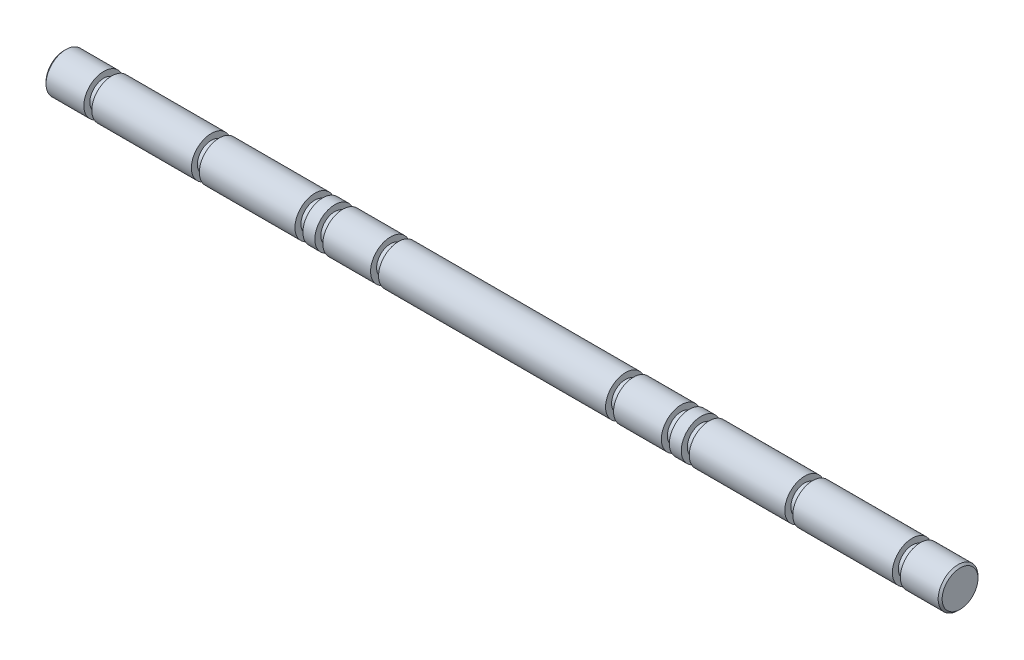
ISO-10303-21;
HEADER;
FILE_DESCRIPTION(('STEP AP214'),'2;1');
FILE_NAME('part.step','',(''),(''),'','','');
FILE_SCHEMA(('AUTOMOTIVE_DESIGN { 1 0 10303 214 1 1 1 1 }'));
ENDSEC;
DATA;
#1=APPLICATION_CONTEXT('core data for automotive mechanical design processes');
#2=APPLICATION_PROTOCOL_DEFINITION('international standard','automotive_design',2000,#1);
#3=PRODUCT_CONTEXT('',#1,'mechanical');
#4=PRODUCT('Part','Part','',(#3));
#5=PRODUCT_RELATED_PRODUCT_CATEGORY('part','',(#4));
#6=PRODUCT_DEFINITION_FORMATION('','',#4);
#7=PRODUCT_DEFINITION_CONTEXT('part definition',#1,'design');
#8=PRODUCT_DEFINITION('design','',#6,#7);
#9=PRODUCT_DEFINITION_SHAPE('','',#8);
#10=(LENGTH_UNIT() NAMED_UNIT(*) SI_UNIT(.MILLI.,.METRE.));
#11=(NAMED_UNIT(*) PLANE_ANGLE_UNIT() SI_UNIT($,.RADIAN.));
#12=(NAMED_UNIT(*) SI_UNIT($,.STERADIAN.) SOLID_ANGLE_UNIT());
#13=UNCERTAINTY_MEASURE_WITH_UNIT(LENGTH_MEASURE(1.E-05),#10,'distance_accuracy_value','');
#14=(GEOMETRIC_REPRESENTATION_CONTEXT(3) GLOBAL_UNCERTAINTY_ASSIGNED_CONTEXT((#13)) GLOBAL_UNIT_ASSIGNED_CONTEXT((#10,
#11,#12)) REPRESENTATION_CONTEXT('',''));
#15=CARTESIAN_POINT('',(0.,0.,0.));
#16=DIRECTION('',(0.,0.,1.));
#17=DIRECTION('',(1.,0.,0.));
#18=AXIS2_PLACEMENT_3D('',#15,#16,#17);
#19=CARTESIAN_POINT('',(57.,0.,0.));
#20=DIRECTION('',(-1.,0.,0.));
#21=DIRECTION('',(0.,0.,1.));
#22=AXIS2_PLACEMENT_3D('',#19,#20,#21);
#23=CYLINDRICAL_SURFACE('',#22,5.);
#24=CARTESIAN_POINT('',(57.,0.,0.));
#25=DIRECTION('',(1.,0.,0.));
#26=DIRECTION('',(0.,0.,-1.));
#27=AXIS2_PLACEMENT_3D('',#24,#25,#26);
#28=CIRCLE('',#27,5.);
#29=CARTESIAN_POINT('',(57.,0.,5.));
#30=VERTEX_POINT('',#29);
#31=EDGE_CURVE('E69',#30,#30,#28,.T.);
#32=CARTESIAN_POINT('',(0.,0.,0.));
#33=DIRECTION('',(1.,0.,0.));
#34=DIRECTION('',(0.,0.,-1.));
#35=AXIS2_PLACEMENT_3D('',#32,#33,#34);
#36=CIRCLE('',#35,5.);
#37=CARTESIAN_POINT('',(0.,0.,5.));
#38=VERTEX_POINT('',#37);
#39=EDGE_CURVE('E65',#38,#38,#36,.T.);
#40=CARTESIAN_POINT('',(57.,0.,5.));
#41=CARTESIAN_POINT('',(56.40625,0.,5.));
#42=CARTESIAN_POINT('',(55.8125,0.,5.));
#43=CARTESIAN_POINT('',(54.625,0.,5.));
#44=CARTESIAN_POINT('',(54.03125,0.,5.));
#45=CARTESIAN_POINT('',(52.84375,0.,5.));
#46=CARTESIAN_POINT('',(52.25,0.,5.));
#47=CARTESIAN_POINT('',(51.0625,0.,5.));
#48=CARTESIAN_POINT('',(50.46875,0.,5.));
#49=CARTESIAN_POINT('',(49.28125,0.,5.));
#50=CARTESIAN_POINT('',(48.6875,0.,5.));
#51=CARTESIAN_POINT('',(47.5,0.,5.));
#52=CARTESIAN_POINT('',(46.90625,0.,5.));
#53=CARTESIAN_POINT('',(45.71875,0.,5.));
#54=CARTESIAN_POINT('',(45.125,0.,5.));
#55=CARTESIAN_POINT('',(43.9375,0.,5.));
#56=CARTESIAN_POINT('',(43.34375,0.,5.));
#57=CARTESIAN_POINT('',(42.15625,0.,5.));
#58=CARTESIAN_POINT('',(41.5625,0.,5.));
#59=CARTESIAN_POINT('',(40.375,0.,5.));
#60=CARTESIAN_POINT('',(39.78125,0.,5.));
#61=CARTESIAN_POINT('',(38.59375,0.,5.));
#62=CARTESIAN_POINT('',(38.,0.,5.));
#63=CARTESIAN_POINT('',(36.8125,0.,5.));
#64=CARTESIAN_POINT('',(36.21875,0.,5.));
#65=CARTESIAN_POINT('',(35.03125,0.,5.));
#66=CARTESIAN_POINT('',(34.4375,0.,5.));
#67=CARTESIAN_POINT('',(33.25,0.,5.));
#68=CARTESIAN_POINT('',(32.65625,0.,5.));
#69=CARTESIAN_POINT('',(31.46875,0.,5.));
#70=CARTESIAN_POINT('',(30.875,0.,5.));
#71=CARTESIAN_POINT('',(29.6875,0.,5.));
#72=CARTESIAN_POINT('',(29.09375,0.,5.));
#73=CARTESIAN_POINT('',(27.90625,0.,5.));
#74=CARTESIAN_POINT('',(27.3125,0.,5.));
#75=CARTESIAN_POINT('',(26.125,0.,5.));
#76=CARTESIAN_POINT('',(25.53125,0.,5.));
#77=CARTESIAN_POINT('',(24.34375,0.,5.));
#78=CARTESIAN_POINT('',(23.75,0.,5.));
#79=CARTESIAN_POINT('',(22.5625,0.,5.));
#80=CARTESIAN_POINT('',(21.96875,0.,5.));
#81=CARTESIAN_POINT('',(20.78125,0.,5.));
#82=CARTESIAN_POINT('',(20.1875,0.,5.));
#83=CARTESIAN_POINT('',(19.,0.,5.));
#84=CARTESIAN_POINT('',(18.40625,0.,5.));
#85=CARTESIAN_POINT('',(17.21875,0.,5.));
#86=CARTESIAN_POINT('',(16.625,0.,5.));
#87=CARTESIAN_POINT('',(15.4375,0.,5.));
#88=CARTESIAN_POINT('',(14.84375,0.,5.));
#89=CARTESIAN_POINT('',(13.65625,0.,5.));
#90=CARTESIAN_POINT('',(13.0625,0.,5.));
#91=CARTESIAN_POINT('',(11.875,0.,5.));
#92=CARTESIAN_POINT('',(11.28125,0.,5.));
#93=CARTESIAN_POINT('',(10.09375,0.,5.));
#94=CARTESIAN_POINT('',(9.5,0.,5.));
#95=CARTESIAN_POINT('',(8.3125,0.,5.));
#96=CARTESIAN_POINT('',(7.71875,0.,5.));
#97=CARTESIAN_POINT('',(6.53125,0.,5.));
#98=CARTESIAN_POINT('',(5.9375,0.,5.));
#99=CARTESIAN_POINT('',(4.75,0.,5.));
#100=CARTESIAN_POINT('',(4.15625,0.,5.));
#101=CARTESIAN_POINT('',(2.96875,0.,5.));
#102=CARTESIAN_POINT('',(2.375,0.,5.));
#103=CARTESIAN_POINT('',(1.1875,0.,5.));
#104=CARTESIAN_POINT('',(0.593749999999999,0.,5.));
#105=CARTESIAN_POINT('',(0.,0.,5.));
#106=B_SPLINE_CURVE_WITH_KNOTS('',3,(#40,#41,#42,#43,#44,#45,#46,#47,#48,#49,#50,#51,#52,#53,
#54,#55,#56,#57,#58,#59,#60,#61,#62,#63,#64,#65,#66,#67,#68,#69,#70,#71,#72,#73,#74,#75,#76,#77,
#78,#79,#80,#81,#82,#83,#84,#85,#86,#87,#88,#89,#90,#91,#92,#93,#94,#95,#96,#97,#98,#99,#100,
#101,#102,#103,#104,#105),.UNSPECIFIED.,.F.,.F.,(4,2,2,2,2,2,2,2,2,2,2,2,2,2,2,2,2,2,2,2,2,2,2,
2,2,2,2,2,2,2,2,2,4),(0.,1.78125,3.5625,5.34374999999999,7.12499999999999,8.90625,10.6875,
12.46875,14.25,16.03125,17.8125,19.59375,21.375,23.15625,24.9375,26.71875,28.5,30.28125,32.0625,
33.84375,35.625,37.40625,39.1875,40.96875,42.75,44.53125,46.3125,48.09375,49.875,51.65625,
53.4375,55.21875,57.),.UNSPECIFIED.);
#107=EDGE_CURVE('BSEAM39',#30,#38,#106,.T.);
#108=ORIENTED_EDGE('',*,*,#31,.F.);
#109=ORIENTED_EDGE('',*,*,#39,.T.);
#110=ORIENTED_EDGE('',*,*,#107,.T.);
#111=ORIENTED_EDGE('',*,*,#107,.F.);
#112=EDGE_LOOP('',(#108,#110,#109,#111));
#113=FACE_BOUND('',#112,.T.);
#114=ADVANCED_FACE('F39',(#113),#23,.T.);
#115=CARTESIAN_POINT('',(57.,0.,0.));
#116=DIRECTION('',(1.,0.,0.));
#117=DIRECTION('',(0.,0.,-1.));
#118=AXIS2_PLACEMENT_3D('',#115,#116,#117);
#119=PLANE('',#118);
#120=CARTESIAN_POINT('',(57.,0.,0.));
#121=DIRECTION('',(1.,0.,0.));
#122=DIRECTION('',(0.,0.,-1.));
#123=AXIS2_PLACEMENT_3D('',#120,#121,#122);
#124=CIRCLE('',#123,3.5);
#125=CARTESIAN_POINT('',(57.,0.,-3.5));
#126=VERTEX_POINT('',#125);
#127=EDGE_CURVE('E78',#126,#126,#124,.T.);
#128=ORIENTED_EDGE('',*,*,#127,.F.);
#129=EDGE_LOOP('',(#128));
#130=FACE_BOUND('',#129,.T.);
#131=ORIENTED_EDGE('',*,*,#31,.T.);
#132=EDGE_LOOP('',(#131));
#133=FACE_BOUND('',#132,.T.);
#134=ADVANCED_FACE('F241',(#130,#133),#119,.T.);
#135=CARTESIAN_POINT('',(0.,0.,0.));
#136=DIRECTION('',(1.,0.,0.));
#137=DIRECTION('',(0.,0.,-1.));
#138=AXIS2_PLACEMENT_3D('',#135,#136,#137);
#139=PLANE('',#138);
#140=CARTESIAN_POINT('',(0.,0.,0.));
#141=DIRECTION('',(-1.,0.,0.));
#142=DIRECTION('',(0.,0.,1.));
#143=AXIS2_PLACEMENT_3D('',#140,#141,#142);
#144=CIRCLE('',#143,3.5);
#145=CARTESIAN_POINT('',(0.,0.,3.5));
#146=VERTEX_POINT('',#145);
#147=EDGE_CURVE('E74',#146,#146,#144,.T.);
#148=ORIENTED_EDGE('',*,*,#147,.F.);
#149=EDGE_LOOP('',(#148));
#150=FACE_BOUND('',#149,.T.);
#151=ORIENTED_EDGE('',*,*,#39,.F.);
#152=EDGE_LOOP('',(#151));
#153=FACE_BOUND('',#152,.T.);
#154=ADVANCED_FACE('F247',(#150,#153),#139,.F.);
#155=CARTESIAN_POINT('',(-2.,0.,0.));
#156=DIRECTION('',(1.,0.,0.));
#157=DIRECTION('',(0.,0.,-1.));
#158=AXIS2_PLACEMENT_3D('',#155,#156,#157);
#159=CYLINDRICAL_SURFACE('',#158,3.5);
#160=CARTESIAN_POINT('',(-2.,0.,0.));
#161=DIRECTION('',(-1.,0.,0.));
#162=DIRECTION('',(0.,0.,1.));
#163=AXIS2_PLACEMENT_3D('',#160,#161,#162);
#164=CIRCLE('',#163,3.5);
#165=CARTESIAN_POINT('',(-2.,0.,3.5));
#166=VERTEX_POINT('',#165);
#167=EDGE_CURVE('E70',#166,#166,#164,.T.);
#168=ORIENTED_EDGE('',*,*,#167,.F.);
#169=EDGE_LOOP('',(#168));
#170=FACE_BOUND('',#169,.T.);
#171=ORIENTED_EDGE('',*,*,#147,.T.);
#172=EDGE_LOOP('',(#171));
#173=FACE_BOUND('',#172,.T.);
#174=ADVANCED_FACE('F259',(#170,#173),#159,.T.);
#175=CARTESIAN_POINT('',(-14.,0.,0.));
#176=DIRECTION('',(1.,0.,0.));
#177=DIRECTION('',(0.,0.,-1.));
#178=AXIS2_PLACEMENT_3D('',#175,#176,#177);
#179=CYLINDRICAL_SURFACE('',#178,5.);
#180=CARTESIAN_POINT('',(-14.,0.,0.));
#181=DIRECTION('',(-1.,0.,0.));
#182=DIRECTION('',(0.,0.,1.));
#183=AXIS2_PLACEMENT_3D('',#180,#181,#182);
#184=CIRCLE('',#183,5.);
#185=CARTESIAN_POINT('',(-14.,0.,5.));
#186=VERTEX_POINT('',#185);
#187=EDGE_CURVE('E82',#186,#186,#184,.T.);
#188=ORIENTED_EDGE('',*,*,#187,.F.);
#189=EDGE_LOOP('',(#188));
#190=FACE_BOUND('',#189,.T.);
#191=CARTESIAN_POINT('',(-2.,0.,0.));
#192=DIRECTION('',(-1.,0.,0.));
#193=DIRECTION('',(0.,0.,1.));
#194=AXIS2_PLACEMENT_3D('',#191,#192,#193);
#195=CIRCLE('',#194,5.);
#196=CARTESIAN_POINT('',(-2.,0.,5.));
#197=VERTEX_POINT('',#196);
#198=EDGE_CURVE('E83',#197,#197,#195,.T.);
#199=ORIENTED_EDGE('',*,*,#198,.T.);
#200=EDGE_LOOP('',(#199));
#201=FACE_BOUND('',#200,.T.);
#202=ADVANCED_FACE('F264',(#190,#201),#179,.T.);
#203=CARTESIAN_POINT('',(-14.,0.,0.));
#204=DIRECTION('',(-1.,0.,0.));
#205=DIRECTION('',(0.,0.,1.));
#206=AXIS2_PLACEMENT_3D('',#203,#204,#205);
#207=PLANE('',#206);
#208=CARTESIAN_POINT('',(-14.,0.,0.));
#209=DIRECTION('',(-1.,0.,0.));
#210=DIRECTION('',(0.,0.,1.));
#211=AXIS2_PLACEMENT_3D('',#208,#209,#210);
#212=CIRCLE('',#211,3.5);
#213=CARTESIAN_POINT('',(-14.,0.,3.5));
#214=VERTEX_POINT('',#213);
#215=EDGE_CURVE('E158',#214,#214,#212,.T.);
#216=ORIENTED_EDGE('',*,*,#215,.F.);
#217=EDGE_LOOP('',(#216));
#218=FACE_BOUND('',#217,.T.);
#219=ORIENTED_EDGE('',*,*,#187,.T.);
#220=EDGE_LOOP('',(#219));
#221=FACE_BOUND('',#220,.T.);
#222=ADVANCED_FACE('F268',(#218,#221),#207,.T.);
#223=CARTESIAN_POINT('',(-2.,0.,0.));
#224=DIRECTION('',(-1.,0.,0.));
#225=DIRECTION('',(0.,0.,1.));
#226=AXIS2_PLACEMENT_3D('',#223,#224,#225);
#227=PLANE('',#226);
#228=ORIENTED_EDGE('',*,*,#167,.T.);
#229=EDGE_LOOP('',(#228));
#230=FACE_BOUND('',#229,.T.);
#231=ORIENTED_EDGE('',*,*,#198,.F.);
#232=EDGE_LOOP('',(#231));
#233=FACE_BOUND('',#232,.T.);
#234=ADVANCED_FACE('F270',(#230,#233),#227,.F.);
#235=CARTESIAN_POINT('',(59.,0.,0.));
#236=DIRECTION('',(-1.,0.,0.));
#237=DIRECTION('',(0.,0.,1.));
#238=AXIS2_PLACEMENT_3D('',#235,#236,#237);
#239=CYLINDRICAL_SURFACE('',#238,3.5);
#240=CARTESIAN_POINT('',(59.,0.,0.));
#241=DIRECTION('',(1.,0.,0.));
#242=DIRECTION('',(0.,0.,-1.));
#243=AXIS2_PLACEMENT_3D('',#240,#241,#242);
#244=CIRCLE('',#243,3.5);
#245=CARTESIAN_POINT('',(59.,0.,-3.5));
#246=VERTEX_POINT('',#245);
#247=EDGE_CURVE('E87',#246,#246,#244,.T.);
#248=ORIENTED_EDGE('',*,*,#247,.F.);
#249=EDGE_LOOP('',(#248));
#250=FACE_BOUND('',#249,.T.);
#251=ORIENTED_EDGE('',*,*,#127,.T.);
#252=EDGE_LOOP('',(#251));
#253=FACE_BOUND('',#252,.T.);
#254=ADVANCED_FACE('F273',(#250,#253),#239,.T.);
#255=CARTESIAN_POINT('',(71.,0.,0.));
#256=DIRECTION('',(-1.,0.,0.));
#257=DIRECTION('',(0.,0.,1.));
#258=AXIS2_PLACEMENT_3D('',#255,#256,#257);
#259=CYLINDRICAL_SURFACE('',#258,5.);
#260=CARTESIAN_POINT('',(71.,0.,0.));
#261=DIRECTION('',(1.,0.,0.));
#262=DIRECTION('',(0.,0.,-1.));
#263=AXIS2_PLACEMENT_3D('',#260,#261,#262);
#264=CIRCLE('',#263,5.);
#265=CARTESIAN_POINT('',(71.,0.,-5.));
#266=VERTEX_POINT('',#265);
#267=EDGE_CURVE('E98',#266,#266,#264,.T.);
#268=ORIENTED_EDGE('',*,*,#267,.F.);
#269=EDGE_LOOP('',(#268));
#270=FACE_BOUND('',#269,.T.);
#271=CARTESIAN_POINT('',(59.,0.,0.));
#272=DIRECTION('',(1.,0.,0.));
#273=DIRECTION('',(0.,0.,-1.));
#274=AXIS2_PLACEMENT_3D('',#271,#272,#273);
#275=CIRCLE('',#274,5.);
#276=CARTESIAN_POINT('',(59.,0.,-5.));
#277=VERTEX_POINT('',#276);
#278=EDGE_CURVE('E99',#277,#277,#275,.T.);
#279=ORIENTED_EDGE('',*,*,#278,.T.);
#280=EDGE_LOOP('',(#279));
#281=FACE_BOUND('',#280,.T.);
#282=ADVANCED_FACE('F280',(#270,#281),#259,.T.);
#283=CARTESIAN_POINT('',(71.,0.,0.));
#284=DIRECTION('',(1.,0.,0.));
#285=DIRECTION('',(0.,0.,-1.));
#286=AXIS2_PLACEMENT_3D('',#283,#284,#285);
#287=PLANE('',#286);
#288=CARTESIAN_POINT('',(71.,0.,0.));
#289=DIRECTION('',(1.,0.,0.));
#290=DIRECTION('',(0.,0.,-1.));
#291=AXIS2_PLACEMENT_3D('',#288,#289,#290);
#292=CIRCLE('',#291,3.5);
#293=CARTESIAN_POINT('',(71.,0.,-3.5));
#294=VERTEX_POINT('',#293);
#295=EDGE_CURVE('E94',#294,#294,#292,.T.);
#296=ORIENTED_EDGE('',*,*,#295,.F.);
#297=EDGE_LOOP('',(#296));
#298=FACE_BOUND('',#297,.T.);
#299=ORIENTED_EDGE('',*,*,#267,.T.);
#300=EDGE_LOOP('',(#299));
#301=FACE_BOUND('',#300,.T.);
#302=ADVANCED_FACE('F284',(#298,#301),#287,.T.);
#303=CARTESIAN_POINT('',(59.,0.,0.));
#304=DIRECTION('',(1.,0.,0.));
#305=DIRECTION('',(0.,0.,-1.));
#306=AXIS2_PLACEMENT_3D('',#303,#304,#305);
#307=PLANE('',#306);
#308=ORIENTED_EDGE('',*,*,#247,.T.);
#309=EDGE_LOOP('',(#308));
#310=FACE_BOUND('',#309,.T.);
#311=ORIENTED_EDGE('',*,*,#278,.F.);
#312=EDGE_LOOP('',(#311));
#313=FACE_BOUND('',#312,.T.);
#314=ADVANCED_FACE('F286',(#310,#313),#307,.F.);
#315=CARTESIAN_POINT('',(73.,0.,0.));
#316=DIRECTION('',(-1.,0.,0.));
#317=DIRECTION('',(0.,0.,1.));
#318=AXIS2_PLACEMENT_3D('',#315,#316,#317);
#319=CYLINDRICAL_SURFACE('',#318,3.5);
#320=CARTESIAN_POINT('',(73.,0.,0.));
#321=DIRECTION('',(1.,0.,0.));
#322=DIRECTION('',(0.,0.,-1.));
#323=AXIS2_PLACEMENT_3D('',#320,#321,#322);
#324=CIRCLE('',#323,3.5);
#325=CARTESIAN_POINT('',(73.,0.,-3.5));
#326=VERTEX_POINT('',#325);
#327=EDGE_CURVE('E103',#326,#326,#324,.T.);
#328=ORIENTED_EDGE('',*,*,#327,.F.);
#329=EDGE_LOOP('',(#328));
#330=FACE_BOUND('',#329,.T.);
#331=ORIENTED_EDGE('',*,*,#295,.T.);
#332=EDGE_LOOP('',(#331));
#333=FACE_BOUND('',#332,.T.);
#334=ADVANCED_FACE('F289',(#330,#333),#319,.T.);
#335=CARTESIAN_POINT('',(76.,0.,0.));
#336=DIRECTION('',(-1.,0.,0.));
#337=DIRECTION('',(0.,0.,1.));
#338=AXIS2_PLACEMENT_3D('',#335,#336,#337);
#339=CYLINDRICAL_SURFACE('',#338,5.);
#340=CARTESIAN_POINT('',(76.,0.,0.));
#341=DIRECTION('',(1.,0.,0.));
#342=DIRECTION('',(0.,0.,-1.));
#343=AXIS2_PLACEMENT_3D('',#340,#341,#342);
#344=CIRCLE('',#343,5.);
#345=CARTESIAN_POINT('',(76.,0.,-5.));
#346=VERTEX_POINT('',#345);
#347=EDGE_CURVE('E114',#346,#346,#344,.T.);
#348=ORIENTED_EDGE('',*,*,#347,.F.);
#349=EDGE_LOOP('',(#348));
#350=FACE_BOUND('',#349,.T.);
#351=CARTESIAN_POINT('',(73.,0.,0.));
#352=DIRECTION('',(1.,0.,0.));
#353=DIRECTION('',(0.,0.,-1.));
#354=AXIS2_PLACEMENT_3D('',#351,#352,#353);
#355=CIRCLE('',#354,5.);
#356=CARTESIAN_POINT('',(73.,0.,-5.));
#357=VERTEX_POINT('',#356);
#358=EDGE_CURVE('E115',#357,#357,#355,.T.);
#359=ORIENTED_EDGE('',*,*,#358,.T.);
#360=EDGE_LOOP('',(#359));
#361=FACE_BOUND('',#360,.T.);
#362=ADVANCED_FACE('F296',(#350,#361),#339,.T.);
#363=CARTESIAN_POINT('',(76.,0.,0.));
#364=DIRECTION('',(1.,0.,0.));
#365=DIRECTION('',(0.,0.,-1.));
#366=AXIS2_PLACEMENT_3D('',#363,#364,#365);
#367=PLANE('',#366);
#368=CARTESIAN_POINT('',(76.,0.,0.));
#369=DIRECTION('',(1.,0.,0.));
#370=DIRECTION('',(0.,0.,-1.));
#371=AXIS2_PLACEMENT_3D('',#368,#369,#370);
#372=CIRCLE('',#371,3.5);
#373=CARTESIAN_POINT('',(76.,0.,-3.5));
#374=VERTEX_POINT('',#373);
#375=EDGE_CURVE('E110',#374,#374,#372,.T.);
#376=ORIENTED_EDGE('',*,*,#375,.F.);
#377=EDGE_LOOP('',(#376));
#378=FACE_BOUND('',#377,.T.);
#379=ORIENTED_EDGE('',*,*,#347,.T.);
#380=EDGE_LOOP('',(#379));
#381=FACE_BOUND('',#380,.T.);
#382=ADVANCED_FACE('F300',(#378,#381),#367,.T.);
#383=CARTESIAN_POINT('',(73.,0.,0.));
#384=DIRECTION('',(1.,0.,0.));
#385=DIRECTION('',(0.,0.,-1.));
#386=AXIS2_PLACEMENT_3D('',#383,#384,#385);
#387=PLANE('',#386);
#388=ORIENTED_EDGE('',*,*,#327,.T.);
#389=EDGE_LOOP('',(#388));
#390=FACE_BOUND('',#389,.T.);
#391=ORIENTED_EDGE('',*,*,#358,.F.);
#392=EDGE_LOOP('',(#391));
#393=FACE_BOUND('',#392,.T.);
#394=ADVANCED_FACE('F302',(#390,#393),#387,.F.);
#395=CARTESIAN_POINT('',(78.,0.,0.));
#396=DIRECTION('',(-1.,0.,0.));
#397=DIRECTION('',(0.,0.,1.));
#398=AXIS2_PLACEMENT_3D('',#395,#396,#397);
#399=CYLINDRICAL_SURFACE('',#398,3.5);
#400=CARTESIAN_POINT('',(78.,0.,0.));
#401=DIRECTION('',(1.,0.,0.));
#402=DIRECTION('',(0.,0.,-1.));
#403=AXIS2_PLACEMENT_3D('',#400,#401,#402);
#404=CIRCLE('',#403,3.5);
#405=CARTESIAN_POINT('',(78.,0.,-3.5));
#406=VERTEX_POINT('',#405);
#407=EDGE_CURVE('E119',#406,#406,#404,.T.);
#408=ORIENTED_EDGE('',*,*,#407,.F.);
#409=EDGE_LOOP('',(#408));
#410=FACE_BOUND('',#409,.T.);
#411=ORIENTED_EDGE('',*,*,#375,.T.);
#412=EDGE_LOOP('',(#411));
#413=FACE_BOUND('',#412,.T.);
#414=ADVANCED_FACE('F305',(#410,#413),#399,.T.);
#415=CARTESIAN_POINT('',(102.,0.,0.));
#416=DIRECTION('',(-1.,0.,0.));
#417=DIRECTION('',(0.,0.,1.));
#418=AXIS2_PLACEMENT_3D('',#415,#416,#417);
#419=CYLINDRICAL_SURFACE('',#418,5.);
#420=CARTESIAN_POINT('',(102.,0.,0.));
#421=DIRECTION('',(1.,0.,0.));
#422=DIRECTION('',(0.,0.,-1.));
#423=AXIS2_PLACEMENT_3D('',#420,#421,#422);
#424=CIRCLE('',#423,5.);
#425=CARTESIAN_POINT('',(102.,0.,-5.));
#426=VERTEX_POINT('',#425);
#427=EDGE_CURVE('E130',#426,#426,#424,.T.);
#428=ORIENTED_EDGE('',*,*,#427,.F.);
#429=EDGE_LOOP('',(#428));
#430=FACE_BOUND('',#429,.T.);
#431=CARTESIAN_POINT('',(78.,0.,0.));
#432=DIRECTION('',(1.,0.,0.));
#433=DIRECTION('',(0.,0.,-1.));
#434=AXIS2_PLACEMENT_3D('',#431,#432,#433);
#435=CIRCLE('',#434,5.);
#436=CARTESIAN_POINT('',(78.,0.,-5.));
#437=VERTEX_POINT('',#436);
#438=EDGE_CURVE('E131',#437,#437,#435,.T.);
#439=ORIENTED_EDGE('',*,*,#438,.T.);
#440=EDGE_LOOP('',(#439));
#441=FACE_BOUND('',#440,.T.);
#442=ADVANCED_FACE('F312',(#430,#441),#419,.T.);
#443=CARTESIAN_POINT('',(102.,0.,0.));
#444=DIRECTION('',(1.,0.,0.));
#445=DIRECTION('',(0.,0.,-1.));
#446=AXIS2_PLACEMENT_3D('',#443,#444,#445);
#447=PLANE('',#446);
#448=CARTESIAN_POINT('',(102.,0.,0.));
#449=DIRECTION('',(1.,0.,0.));
#450=DIRECTION('',(0.,0.,-1.));
#451=AXIS2_PLACEMENT_3D('',#448,#449,#450);
#452=CIRCLE('',#451,3.5);
#453=CARTESIAN_POINT('',(102.,0.,-3.5));
#454=VERTEX_POINT('',#453);
#455=EDGE_CURVE('E126',#454,#454,#452,.T.);
#456=ORIENTED_EDGE('',*,*,#455,.F.);
#457=EDGE_LOOP('',(#456));
#458=FACE_BOUND('',#457,.T.);
#459=ORIENTED_EDGE('',*,*,#427,.T.);
#460=EDGE_LOOP('',(#459));
#461=FACE_BOUND('',#460,.T.);
#462=ADVANCED_FACE('F316',(#458,#461),#447,.T.);
#463=CARTESIAN_POINT('',(78.,0.,0.));
#464=DIRECTION('',(1.,0.,0.));
#465=DIRECTION('',(0.,0.,-1.));
#466=AXIS2_PLACEMENT_3D('',#463,#464,#465);
#467=PLANE('',#466);
#468=ORIENTED_EDGE('',*,*,#407,.T.);
#469=EDGE_LOOP('',(#468));
#470=FACE_BOUND('',#469,.T.);
#471=ORIENTED_EDGE('',*,*,#438,.F.);
#472=EDGE_LOOP('',(#471));
#473=FACE_BOUND('',#472,.T.);
#474=ADVANCED_FACE('F318',(#470,#473),#467,.F.);
#475=CARTESIAN_POINT('',(104.,0.,0.));
#476=DIRECTION('',(-1.,0.,0.));
#477=DIRECTION('',(0.,0.,1.));
#478=AXIS2_PLACEMENT_3D('',#475,#476,#477);
#479=CYLINDRICAL_SURFACE('',#478,3.5);
#480=CARTESIAN_POINT('',(104.,0.,0.));
#481=DIRECTION('',(1.,0.,0.));
#482=DIRECTION('',(0.,0.,-1.));
#483=AXIS2_PLACEMENT_3D('',#480,#481,#482);
#484=CIRCLE('',#483,3.5);
#485=CARTESIAN_POINT('',(104.,0.,-3.5));
#486=VERTEX_POINT('',#485);
#487=EDGE_CURVE('E135',#486,#486,#484,.T.);
#488=ORIENTED_EDGE('',*,*,#487,.F.);
#489=EDGE_LOOP('',(#488));
#490=FACE_BOUND('',#489,.T.);
#491=ORIENTED_EDGE('',*,*,#455,.T.);
#492=EDGE_LOOP('',(#491));
#493=FACE_BOUND('',#492,.T.);
#494=ADVANCED_FACE('F321',(#490,#493),#479,.T.);
#495=CARTESIAN_POINT('',(129.,0.,0.));
#496=DIRECTION('',(-1.,0.,0.));
#497=DIRECTION('',(0.,0.,1.));
#498=AXIS2_PLACEMENT_3D('',#495,#496,#497);
#499=CYLINDRICAL_SURFACE('',#498,5.);
#500=CARTESIAN_POINT('',(129.,0.,0.));
#501=DIRECTION('',(1.,0.,0.));
#502=DIRECTION('',(0.,0.,-1.));
#503=AXIS2_PLACEMENT_3D('',#500,#501,#502);
#504=CIRCLE('',#503,5.);
#505=CARTESIAN_POINT('',(129.,0.,-5.));
#506=VERTEX_POINT('',#505);
#507=EDGE_CURVE('E146',#506,#506,#504,.T.);
#508=ORIENTED_EDGE('',*,*,#507,.F.);
#509=EDGE_LOOP('',(#508));
#510=FACE_BOUND('',#509,.T.);
#511=CARTESIAN_POINT('',(104.,0.,0.));
#512=DIRECTION('',(1.,0.,0.));
#513=DIRECTION('',(0.,0.,-1.));
#514=AXIS2_PLACEMENT_3D('',#511,#512,#513);
#515=CIRCLE('',#514,5.);
#516=CARTESIAN_POINT('',(104.,0.,-5.));
#517=VERTEX_POINT('',#516);
#518=EDGE_CURVE('E147',#517,#517,#515,.T.);
#519=ORIENTED_EDGE('',*,*,#518,.T.);
#520=EDGE_LOOP('',(#519));
#521=FACE_BOUND('',#520,.T.);
#522=ADVANCED_FACE('F328',(#510,#521),#499,.T.);
#523=CARTESIAN_POINT('',(129.,0.,0.));
#524=DIRECTION('',(1.,0.,0.));
#525=DIRECTION('',(0.,0.,-1.));
#526=AXIS2_PLACEMENT_3D('',#523,#524,#525);
#527=PLANE('',#526);
#528=CARTESIAN_POINT('',(129.,0.,0.));
#529=DIRECTION('',(1.,0.,0.));
#530=DIRECTION('',(0.,0.,-1.));
#531=AXIS2_PLACEMENT_3D('',#528,#529,#530);
#532=CIRCLE('',#531,3.5);
#533=CARTESIAN_POINT('',(129.,0.,-3.5));
#534=VERTEX_POINT('',#533);
#535=EDGE_CURVE('E142',#534,#534,#532,.T.);
#536=ORIENTED_EDGE('',*,*,#535,.F.);
#537=EDGE_LOOP('',(#536));
#538=FACE_BOUND('',#537,.T.);
#539=ORIENTED_EDGE('',*,*,#507,.T.);
#540=EDGE_LOOP('',(#539));
#541=FACE_BOUND('',#540,.T.);
#542=ADVANCED_FACE('F332',(#538,#541),#527,.T.);
#543=CARTESIAN_POINT('',(104.,0.,0.));
#544=DIRECTION('',(1.,0.,0.));
#545=DIRECTION('',(0.,0.,-1.));
#546=AXIS2_PLACEMENT_3D('',#543,#544,#545);
#547=PLANE('',#546);
#548=ORIENTED_EDGE('',*,*,#487,.T.);
#549=EDGE_LOOP('',(#548));
#550=FACE_BOUND('',#549,.T.);
#551=ORIENTED_EDGE('',*,*,#518,.F.);
#552=EDGE_LOOP('',(#551));
#553=FACE_BOUND('',#552,.T.);
#554=ADVANCED_FACE('F334',(#550,#553),#547,.F.);
#555=CARTESIAN_POINT('',(131.,0.,0.));
#556=DIRECTION('',(-1.,0.,0.));
#557=DIRECTION('',(0.,0.,1.));
#558=AXIS2_PLACEMENT_3D('',#555,#556,#557);
#559=CYLINDRICAL_SURFACE('',#558,3.5);
#560=CARTESIAN_POINT('',(131.,0.,0.));
#561=DIRECTION('',(1.,0.,0.));
#562=DIRECTION('',(0.,0.,-1.));
#563=AXIS2_PLACEMENT_3D('',#560,#561,#562);
#564=CIRCLE('',#563,3.5);
#565=CARTESIAN_POINT('',(131.,0.,-3.5));
#566=VERTEX_POINT('',#565);
#567=EDGE_CURVE('E151',#566,#566,#564,.T.);
#568=ORIENTED_EDGE('',*,*,#567,.F.);
#569=EDGE_LOOP('',(#568));
#570=FACE_BOUND('',#569,.T.);
#571=ORIENTED_EDGE('',*,*,#535,.T.);
#572=EDGE_LOOP('',(#571));
#573=FACE_BOUND('',#572,.T.);
#574=ADVANCED_FACE('F337',(#570,#573),#559,.T.);
#575=CARTESIAN_POINT('',(141.,0.,0.));
#576=DIRECTION('',(-1.,0.,0.));
#577=DIRECTION('',(0.,0.,1.));
#578=AXIS2_PLACEMENT_3D('',#575,#576,#577);
#579=CYLINDRICAL_SURFACE('',#578,5.);
#580=CARTESIAN_POINT('',(140.5,0.,0.));
#581=DIRECTION('',(1.,0.,0.));
#582=DIRECTION('',(0.,0.,-1.));
#583=AXIS2_PLACEMENT_3D('',#580,#581,#582);
#584=CIRCLE('',#583,5.);
#585=CARTESIAN_POINT('',(140.5,0.,-5.));
#586=VERTEX_POINT('',#585);
#587=EDGE_CURVE('E53',#586,#586,#584,.F.);
#588=ORIENTED_EDGE('',*,*,#587,.T.);
#589=EDGE_LOOP('',(#588));
#590=FACE_BOUND('',#589,.T.);
#591=CARTESIAN_POINT('',(131.,0.,0.));
#592=DIRECTION('',(1.,0.,0.));
#593=DIRECTION('',(0.,0.,-1.));
#594=AXIS2_PLACEMENT_3D('',#591,#592,#593);
#595=CIRCLE('',#594,5.);
#596=CARTESIAN_POINT('',(131.,0.,-5.));
#597=VERTEX_POINT('',#596);
#598=EDGE_CURVE('E162',#597,#597,#595,.T.);
#599=ORIENTED_EDGE('',*,*,#598,.T.);
#600=EDGE_LOOP('',(#599));
#601=FACE_BOUND('',#600,.T.);
#602=ADVANCED_FACE('F344',(#590,#601),#579,.T.);
#603=CARTESIAN_POINT('',(141.,0.,0.));
#604=DIRECTION('',(1.,0.,0.));
#605=DIRECTION('',(0.,0.,-1.));
#606=AXIS2_PLACEMENT_3D('',#603,#604,#605);
#607=PLANE('',#606);
#608=CARTESIAN_POINT('',(141.,0.,0.));
#609=DIRECTION('',(1.,0.,0.));
#610=DIRECTION('',(0.,0.,-1.));
#611=AXIS2_PLACEMENT_3D('',#608,#609,#610);
#612=CIRCLE('',#611,4.5);
#613=CARTESIAN_POINT('',(141.,0.,-4.5));
#614=VERTEX_POINT('',#613);
#615=EDGE_CURVE('E58',#614,#614,#612,.T.);
#616=ORIENTED_EDGE('',*,*,#615,.T.);
#617=EDGE_LOOP('',(#616));
#618=FACE_BOUND('',#617,.T.);
#619=ADVANCED_FACE('F348',(#618),#607,.T.);
#620=CARTESIAN_POINT('',(131.,0.,0.));
#621=DIRECTION('',(1.,0.,0.));
#622=DIRECTION('',(0.,0.,-1.));
#623=AXIS2_PLACEMENT_3D('',#620,#621,#622);
#624=PLANE('',#623);
#625=ORIENTED_EDGE('',*,*,#567,.T.);
#626=EDGE_LOOP('',(#625));
#627=FACE_BOUND('',#626,.T.);
#628=ORIENTED_EDGE('',*,*,#598,.F.);
#629=EDGE_LOOP('',(#628));
#630=FACE_BOUND('',#629,.T.);
#631=ADVANCED_FACE('F350',(#627,#630),#624,.F.);
#632=CARTESIAN_POINT('',(-16.,0.,0.));
#633=DIRECTION('',(1.,0.,0.));
#634=DIRECTION('',(0.,0.,-1.));
#635=AXIS2_PLACEMENT_3D('',#632,#633,#634);
#636=CYLINDRICAL_SURFACE('',#635,3.5);
#637=CARTESIAN_POINT('',(-16.,0.,0.));
#638=DIRECTION('',(-1.,0.,0.));
#639=DIRECTION('',(0.,0.,1.));
#640=AXIS2_PLACEMENT_3D('',#637,#638,#639);
#641=CIRCLE('',#640,3.5);
#642=CARTESIAN_POINT('',(-16.,0.,3.5));
#643=VERTEX_POINT('',#642);
#644=EDGE_CURVE('E166',#643,#643,#641,.T.);
#645=ORIENTED_EDGE('',*,*,#644,.F.);
#646=EDGE_LOOP('',(#645));
#647=FACE_BOUND('',#646,.T.);
#648=ORIENTED_EDGE('',*,*,#215,.T.);
#649=EDGE_LOOP('',(#648));
#650=FACE_BOUND('',#649,.T.);
#651=ADVANCED_FACE('F353',(#647,#650),#636,.T.);
#652=CARTESIAN_POINT('',(-19.,0.,0.));
#653=DIRECTION('',(1.,0.,0.));
#654=DIRECTION('',(0.,0.,-1.));
#655=AXIS2_PLACEMENT_3D('',#652,#653,#654);
#656=CYLINDRICAL_SURFACE('',#655,5.);
#657=CARTESIAN_POINT('',(-19.,0.,0.));
#658=DIRECTION('',(-1.,0.,0.));
#659=DIRECTION('',(0.,0.,1.));
#660=AXIS2_PLACEMENT_3D('',#657,#658,#659);
#661=CIRCLE('',#660,5.);
#662=CARTESIAN_POINT('',(-19.,0.,5.));
#663=VERTEX_POINT('',#662);
#664=EDGE_CURVE('E174',#663,#663,#661,.T.);
#665=ORIENTED_EDGE('',*,*,#664,.F.);
#666=EDGE_LOOP('',(#665));
#667=FACE_BOUND('',#666,.T.);
#668=CARTESIAN_POINT('',(-16.,0.,0.));
#669=DIRECTION('',(-1.,0.,0.));
#670=DIRECTION('',(0.,0.,1.));
#671=AXIS2_PLACEMENT_3D('',#668,#669,#670);
#672=CIRCLE('',#671,5.);
#673=CARTESIAN_POINT('',(-16.,0.,5.));
#674=VERTEX_POINT('',#673);
#675=EDGE_CURVE('E175',#674,#674,#672,.T.);
#676=ORIENTED_EDGE('',*,*,#675,.T.);
#677=EDGE_LOOP('',(#676));
#678=FACE_BOUND('',#677,.T.);
#679=ADVANCED_FACE('F360',(#667,#678),#656,.T.);
#680=CARTESIAN_POINT('',(-19.,0.,0.));
#681=DIRECTION('',(-1.,0.,0.));
#682=DIRECTION('',(0.,0.,1.));
#683=AXIS2_PLACEMENT_3D('',#680,#681,#682);
#684=PLANE('',#683);
#685=CARTESIAN_POINT('',(-19.,0.,0.));
#686=DIRECTION('',(-1.,0.,0.));
#687=DIRECTION('',(0.,0.,1.));
#688=AXIS2_PLACEMENT_3D('',#685,#686,#687);
#689=CIRCLE('',#688,3.5);
#690=CARTESIAN_POINT('',(-19.,0.,3.5));
#691=VERTEX_POINT('',#690);
#692=EDGE_CURVE('E170',#691,#691,#689,.T.);
#693=ORIENTED_EDGE('',*,*,#692,.F.);
#694=EDGE_LOOP('',(#693));
#695=FACE_BOUND('',#694,.T.);
#696=ORIENTED_EDGE('',*,*,#664,.T.);
#697=EDGE_LOOP('',(#696));
#698=FACE_BOUND('',#697,.T.);
#699=ADVANCED_FACE('F364',(#695,#698),#684,.T.);
#700=CARTESIAN_POINT('',(-16.,0.,0.));
#701=DIRECTION('',(-1.,0.,0.));
#702=DIRECTION('',(0.,0.,1.));
#703=AXIS2_PLACEMENT_3D('',#700,#701,#702);
#704=PLANE('',#703);
#705=ORIENTED_EDGE('',*,*,#644,.T.);
#706=EDGE_LOOP('',(#705));
#707=FACE_BOUND('',#706,.T.);
#708=ORIENTED_EDGE('',*,*,#675,.F.);
#709=EDGE_LOOP('',(#708));
#710=FACE_BOUND('',#709,.T.);
#711=ADVANCED_FACE('F366',(#707,#710),#704,.F.);
#712=CARTESIAN_POINT('',(-21.,0.,0.));
#713=DIRECTION('',(1.,0.,0.));
#714=DIRECTION('',(0.,0.,-1.));
#715=AXIS2_PLACEMENT_3D('',#712,#713,#714);
#716=CYLINDRICAL_SURFACE('',#715,3.5);
#717=CARTESIAN_POINT('',(-21.,0.,0.));
#718=DIRECTION('',(-1.,0.,0.));
#719=DIRECTION('',(0.,0.,1.));
#720=AXIS2_PLACEMENT_3D('',#717,#718,#719);
#721=CIRCLE('',#720,3.5);
#722=CARTESIAN_POINT('',(-21.,0.,3.5));
#723=VERTEX_POINT('',#722);
#724=EDGE_CURVE('E179',#723,#723,#721,.T.);
#725=ORIENTED_EDGE('',*,*,#724,.F.);
#726=EDGE_LOOP('',(#725));
#727=FACE_BOUND('',#726,.T.);
#728=ORIENTED_EDGE('',*,*,#692,.T.);
#729=EDGE_LOOP('',(#728));
#730=FACE_BOUND('',#729,.T.);
#731=ADVANCED_FACE('F369',(#727,#730),#716,.T.);
#732=CARTESIAN_POINT('',(-45.,0.,0.));
#733=DIRECTION('',(1.,0.,0.));
#734=DIRECTION('',(0.,0.,-1.));
#735=AXIS2_PLACEMENT_3D('',#732,#733,#734);
#736=CYLINDRICAL_SURFACE('',#735,5.);
#737=CARTESIAN_POINT('',(-45.,0.,0.));
#738=DIRECTION('',(-1.,0.,0.));
#739=DIRECTION('',(0.,0.,1.));
#740=AXIS2_PLACEMENT_3D('',#737,#738,#739);
#741=CIRCLE('',#740,5.);
#742=CARTESIAN_POINT('',(-45.,0.,5.));
#743=VERTEX_POINT('',#742);
#744=EDGE_CURVE('E190',#743,#743,#741,.T.);
#745=ORIENTED_EDGE('',*,*,#744,.F.);
#746=EDGE_LOOP('',(#745));
#747=FACE_BOUND('',#746,.T.);
#748=CARTESIAN_POINT('',(-21.,0.,0.));
#749=DIRECTION('',(-1.,0.,0.));
#750=DIRECTION('',(0.,0.,1.));
#751=AXIS2_PLACEMENT_3D('',#748,#749,#750);
#752=CIRCLE('',#751,5.);
#753=CARTESIAN_POINT('',(-21.,0.,5.));
#754=VERTEX_POINT('',#753);
#755=EDGE_CURVE('E191',#754,#754,#752,.T.);
#756=ORIENTED_EDGE('',*,*,#755,.T.);
#757=EDGE_LOOP('',(#756));
#758=FACE_BOUND('',#757,.T.);
#759=ADVANCED_FACE('F376',(#747,#758),#736,.T.);
#760=CARTESIAN_POINT('',(-45.,0.,0.));
#761=DIRECTION('',(-1.,0.,0.));
#762=DIRECTION('',(0.,0.,1.));
#763=AXIS2_PLACEMENT_3D('',#760,#761,#762);
#764=PLANE('',#763);
#765=CARTESIAN_POINT('',(-45.,0.,0.));
#766=DIRECTION('',(-1.,0.,0.));
#767=DIRECTION('',(0.,0.,1.));
#768=AXIS2_PLACEMENT_3D('',#765,#766,#767);
#769=CIRCLE('',#768,3.5);
#770=CARTESIAN_POINT('',(-45.,0.,3.5));
#771=VERTEX_POINT('',#770);
#772=EDGE_CURVE('E186',#771,#771,#769,.T.);
#773=ORIENTED_EDGE('',*,*,#772,.F.);
#774=EDGE_LOOP('',(#773));
#775=FACE_BOUND('',#774,.T.);
#776=ORIENTED_EDGE('',*,*,#744,.T.);
#777=EDGE_LOOP('',(#776));
#778=FACE_BOUND('',#777,.T.);
#779=ADVANCED_FACE('F380',(#775,#778),#764,.T.);
#780=CARTESIAN_POINT('',(-21.,0.,0.));
#781=DIRECTION('',(-1.,0.,0.));
#782=DIRECTION('',(0.,0.,1.));
#783=AXIS2_PLACEMENT_3D('',#780,#781,#782);
#784=PLANE('',#783);
#785=ORIENTED_EDGE('',*,*,#724,.T.);
#786=EDGE_LOOP('',(#785));
#787=FACE_BOUND('',#786,.T.);
#788=ORIENTED_EDGE('',*,*,#755,.F.);
#789=EDGE_LOOP('',(#788));
#790=FACE_BOUND('',#789,.T.);
#791=ADVANCED_FACE('F382',(#787,#790),#784,.F.);
#792=CARTESIAN_POINT('',(-47.,0.,0.));
#793=DIRECTION('',(1.,0.,0.));
#794=DIRECTION('',(0.,0.,-1.));
#795=AXIS2_PLACEMENT_3D('',#792,#793,#794);
#796=CYLINDRICAL_SURFACE('',#795,3.5);
#797=CARTESIAN_POINT('',(-47.,0.,0.));
#798=DIRECTION('',(-1.,0.,0.));
#799=DIRECTION('',(0.,0.,1.));
#800=AXIS2_PLACEMENT_3D('',#797,#798,#799);
#801=CIRCLE('',#800,3.5);
#802=CARTESIAN_POINT('',(-47.,0.,3.5));
#803=VERTEX_POINT('',#802);
#804=EDGE_CURVE('E195',#803,#803,#801,.T.);
#805=ORIENTED_EDGE('',*,*,#804,.F.);
#806=EDGE_LOOP('',(#805));
#807=FACE_BOUND('',#806,.T.);
#808=ORIENTED_EDGE('',*,*,#772,.T.);
#809=EDGE_LOOP('',(#808));
#810=FACE_BOUND('',#809,.T.);
#811=ADVANCED_FACE('F385',(#807,#810),#796,.T.);
#812=CARTESIAN_POINT('',(-72.,0.,0.));
#813=DIRECTION('',(1.,0.,0.));
#814=DIRECTION('',(0.,0.,-1.));
#815=AXIS2_PLACEMENT_3D('',#812,#813,#814);
#816=CYLINDRICAL_SURFACE('',#815,5.);
#817=CARTESIAN_POINT('',(-72.,0.,0.));
#818=DIRECTION('',(-1.,0.,0.));
#819=DIRECTION('',(0.,0.,1.));
#820=AXIS2_PLACEMENT_3D('',#817,#818,#819);
#821=CIRCLE('',#820,5.);
#822=CARTESIAN_POINT('',(-72.,0.,5.));
#823=VERTEX_POINT('',#822);
#824=EDGE_CURVE('E205',#823,#823,#821,.T.);
#825=ORIENTED_EDGE('',*,*,#824,.F.);
#826=EDGE_LOOP('',(#825));
#827=FACE_BOUND('',#826,.T.);
#828=CARTESIAN_POINT('',(-47.,0.,0.));
#829=DIRECTION('',(-1.,0.,0.));
#830=DIRECTION('',(0.,0.,1.));
#831=AXIS2_PLACEMENT_3D('',#828,#829,#830);
#832=CIRCLE('',#831,5.);
#833=CARTESIAN_POINT('',(-47.,0.,5.));
#834=VERTEX_POINT('',#833);
#835=EDGE_CURVE('E206',#834,#834,#832,.T.);
#836=ORIENTED_EDGE('',*,*,#835,.T.);
#837=EDGE_LOOP('',(#836));
#838=FACE_BOUND('',#837,.T.);
#839=ADVANCED_FACE('F392',(#827,#838),#816,.T.);
#840=CARTESIAN_POINT('',(-72.,0.,0.));
#841=DIRECTION('',(-1.,0.,0.));
#842=DIRECTION('',(0.,0.,1.));
#843=AXIS2_PLACEMENT_3D('',#840,#841,#842);
#844=PLANE('',#843);
#845=CARTESIAN_POINT('',(-72.,0.,0.));
#846=DIRECTION('',(-1.,0.,0.));
#847=DIRECTION('',(0.,0.,1.));
#848=AXIS2_PLACEMENT_3D('',#845,#846,#847);
#849=CIRCLE('',#848,3.5);
#850=CARTESIAN_POINT('',(-72.,0.,3.5));
#851=VERTEX_POINT('',#850);
#852=EDGE_CURVE('E64',#851,#851,#849,.T.);
#853=ORIENTED_EDGE('',*,*,#852,.F.);
#854=EDGE_LOOP('',(#853));
#855=FACE_BOUND('',#854,.T.);
#856=ORIENTED_EDGE('',*,*,#824,.T.);
#857=EDGE_LOOP('',(#856));
#858=FACE_BOUND('',#857,.T.);
#859=ADVANCED_FACE('F396',(#855,#858),#844,.T.);
#860=CARTESIAN_POINT('',(-47.,0.,0.));
#861=DIRECTION('',(-1.,0.,0.));
#862=DIRECTION('',(0.,0.,1.));
#863=AXIS2_PLACEMENT_3D('',#860,#861,#862);
#864=PLANE('',#863);
#865=ORIENTED_EDGE('',*,*,#804,.T.);
#866=EDGE_LOOP('',(#865));
#867=FACE_BOUND('',#866,.T.);
#868=ORIENTED_EDGE('',*,*,#835,.F.);
#869=EDGE_LOOP('',(#868));
#870=FACE_BOUND('',#869,.T.);
#871=ADVANCED_FACE('F398',(#867,#870),#864,.F.);
#872=CARTESIAN_POINT('',(-74.,0.,0.));
#873=DIRECTION('',(1.,0.,0.));
#874=DIRECTION('',(0.,0.,-1.));
#875=AXIS2_PLACEMENT_3D('',#872,#873,#874);
#876=CYLINDRICAL_SURFACE('',#875,3.5);
#877=CARTESIAN_POINT('',(-74.,0.,0.));
#878=DIRECTION('',(-1.,0.,0.));
#879=DIRECTION('',(0.,0.,1.));
#880=AXIS2_PLACEMENT_3D('',#877,#878,#879);
#881=CIRCLE('',#880,3.5);
#882=CARTESIAN_POINT('',(-74.,0.,3.5));
#883=VERTEX_POINT('',#882);
#884=EDGE_CURVE('E210',#883,#883,#881,.T.);
#885=ORIENTED_EDGE('',*,*,#884,.F.);
#886=EDGE_LOOP('',(#885));
#887=FACE_BOUND('',#886,.T.);
#888=ORIENTED_EDGE('',*,*,#852,.T.);
#889=EDGE_LOOP('',(#888));
#890=FACE_BOUND('',#889,.T.);
#891=ADVANCED_FACE('F401',(#887,#890),#876,.T.);
#892=CARTESIAN_POINT('',(-84.,0.,0.));
#893=DIRECTION('',(1.,0.,0.));
#894=DIRECTION('',(0.,0.,-1.));
#895=AXIS2_PLACEMENT_3D('',#892,#893,#894);
#896=CYLINDRICAL_SURFACE('',#895,5.);
#897=CARTESIAN_POINT('',(-83.5,0.,0.));
#898=DIRECTION('',(-1.,0.,0.));
#899=DIRECTION('',(0.,0.,1.));
#900=AXIS2_PLACEMENT_3D('',#897,#898,#899);
#901=CIRCLE('',#900,5.);
#902=CARTESIAN_POINT('',(-83.5,0.,5.));
#903=VERTEX_POINT('',#902);
#904=EDGE_CURVE('E10',#903,#903,#901,.F.);
#905=ORIENTED_EDGE('',*,*,#904,.T.);
#906=EDGE_LOOP('',(#905));
#907=FACE_BOUND('',#906,.T.);
#908=CARTESIAN_POINT('',(-74.,0.,0.));
#909=DIRECTION('',(-1.,0.,0.));
#910=DIRECTION('',(0.,0.,1.));
#911=AXIS2_PLACEMENT_3D('',#908,#909,#910);
#912=CIRCLE('',#911,5.);
#913=CARTESIAN_POINT('',(-74.,0.,5.));
#914=VERTEX_POINT('',#913);
#915=EDGE_CURVE('E220',#914,#914,#912,.T.);
#916=ORIENTED_EDGE('',*,*,#915,.T.);
#917=EDGE_LOOP('',(#916));
#918=FACE_BOUND('',#917,.T.);
#919=ADVANCED_FACE('F225',(#907,#918),#896,.T.);
#920=CARTESIAN_POINT('',(-84.,0.,0.));
#921=DIRECTION('',(-1.,0.,0.));
#922=DIRECTION('',(0.,0.,1.));
#923=AXIS2_PLACEMENT_3D('',#920,#921,#922);
#924=PLANE('',#923);
#925=CARTESIAN_POINT('',(-84.,0.,0.));
#926=DIRECTION('',(-1.,0.,0.));
#927=DIRECTION('',(0.,0.,1.));
#928=AXIS2_PLACEMENT_3D('',#925,#926,#927);
#929=CIRCLE('',#928,4.5);
#930=CARTESIAN_POINT('',(-84.,0.,4.5));
#931=VERTEX_POINT('',#930);
#932=EDGE_CURVE('E48',#931,#931,#929,.T.);
#933=ORIENTED_EDGE('',*,*,#932,.T.);
#934=EDGE_LOOP('',(#933));
#935=FACE_BOUND('',#934,.T.);
#936=ADVANCED_FACE('F230',(#935),#924,.T.);
#937=CARTESIAN_POINT('',(-74.,0.,0.));
#938=DIRECTION('',(-1.,0.,0.));
#939=DIRECTION('',(0.,0.,1.));
#940=AXIS2_PLACEMENT_3D('',#937,#938,#939);
#941=PLANE('',#940);
#942=ORIENTED_EDGE('',*,*,#884,.T.);
#943=EDGE_LOOP('',(#942));
#944=FACE_BOUND('',#943,.T.);
#945=ORIENTED_EDGE('',*,*,#915,.F.);
#946=EDGE_LOOP('',(#945));
#947=FACE_BOUND('',#946,.T.);
#948=ADVANCED_FACE('F227',(#944,#947),#941,.F.);
#949=CARTESIAN_POINT('',(141.,0.,0.));
#950=DIRECTION('',(-1.,0.,0.));
#951=DIRECTION('',(0.,0.,1.));
#952=AXIS2_PLACEMENT_3D('',#949,#950,#951);
#953=CONICAL_SURFACE('',#952,4.5,0.785398163397444);
#954=ORIENTED_EDGE('',*,*,#587,.F.);
#955=EDGE_LOOP('',(#954));
#956=FACE_BOUND('',#955,.T.);
#957=ORIENTED_EDGE('',*,*,#615,.F.);
#958=EDGE_LOOP('',(#957));
#959=FACE_BOUND('',#958,.T.);
#960=ADVANCED_FACE('F229',(#956,#959),#953,.T.);
#961=CARTESIAN_POINT('',(-84.,0.,0.));
#962=DIRECTION('',(1.,0.,0.));
#963=DIRECTION('',(0.,0.,-1.));
#964=AXIS2_PLACEMENT_3D('',#961,#962,#963);
#965=CONICAL_SURFACE('',#964,4.5,0.78539816339743);
#966=ORIENTED_EDGE('',*,*,#904,.F.);
#967=EDGE_LOOP('',(#966));
#968=FACE_BOUND('',#967,.T.);
#969=ORIENTED_EDGE('',*,*,#932,.F.);
#970=EDGE_LOOP('',(#969));
#971=FACE_BOUND('',#970,.T.);
#972=ADVANCED_FACE('F42',(#968,#971),#965,.T.);
#973=CLOSED_SHELL('',(#114,#134,#154,#174,#202,#222,#234,#254,#282,#302,#314,#334,#362,#382,
#394,#414,#442,#462,#474,#494,#522,#542,#554,#574,#602,#619,#631,#651,#679,#699,#711,#731,#759,
#779,#791,#811,#839,#859,#871,#891,#919,#936,#948,#960,#972));
#974=MANIFOLD_SOLID_BREP('B2',#973);
#975=ADVANCED_BREP_SHAPE_REPRESENTATION('',(#18,#974),#14);
#976=SHAPE_DEFINITION_REPRESENTATION(#9,#975);
ENDSEC;
END-ISO-10303-21;
